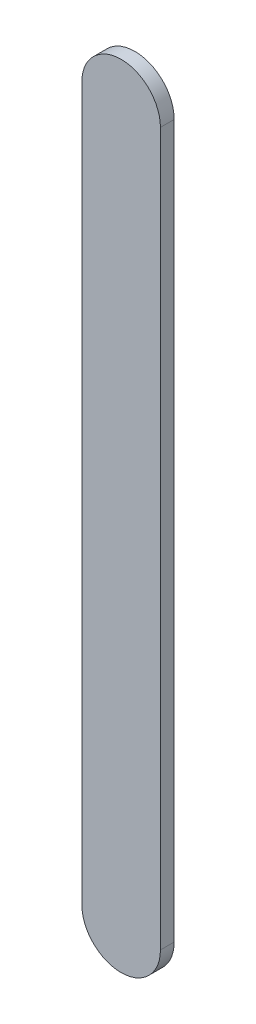
ISO-10303-21;
HEADER;
FILE_DESCRIPTION(('STEP AP214'),'2;1');
FILE_NAME('part.step','',(''),(''),'','','');
FILE_SCHEMA(('AUTOMOTIVE_DESIGN { 1 0 10303 214 1 1 1 1 }'));
ENDSEC;
DATA;
#1=APPLICATION_CONTEXT('core data for automotive mechanical design processes');
#2=APPLICATION_PROTOCOL_DEFINITION('international standard','automotive_design',2000,#1);
#3=PRODUCT_CONTEXT('',#1,'mechanical');
#4=PRODUCT('Part','Part','',(#3));
#5=PRODUCT_RELATED_PRODUCT_CATEGORY('part','',(#4));
#6=PRODUCT_DEFINITION_FORMATION('','',#4);
#7=PRODUCT_DEFINITION_CONTEXT('part definition',#1,'design');
#8=PRODUCT_DEFINITION('design','',#6,#7);
#9=PRODUCT_DEFINITION_SHAPE('','',#8);
#10=(LENGTH_UNIT() NAMED_UNIT(*) SI_UNIT(.MILLI.,.METRE.));
#11=(NAMED_UNIT(*) PLANE_ANGLE_UNIT() SI_UNIT($,.RADIAN.));
#12=(NAMED_UNIT(*) SI_UNIT($,.STERADIAN.) SOLID_ANGLE_UNIT());
#13=UNCERTAINTY_MEASURE_WITH_UNIT(LENGTH_MEASURE(1.E-05),#10,'distance_accuracy_value','');
#14=(GEOMETRIC_REPRESENTATION_CONTEXT(3) GLOBAL_UNCERTAINTY_ASSIGNED_CONTEXT((#13)) GLOBAL_UNIT_ASSIGNED_CONTEXT((#10,
#11,#12)) REPRESENTATION_CONTEXT('',''));
#15=CARTESIAN_POINT('',(0.,0.,0.));
#16=DIRECTION('',(0.,0.,1.));
#17=DIRECTION('',(1.,0.,0.));
#18=AXIS2_PLACEMENT_3D('',#15,#16,#17);
#19=CARTESIAN_POINT('',(84.35,-113.3375,1.635));
#20=DIRECTION('',(0.,0.,1.));
#21=DIRECTION('',(1.,0.,0.));
#22=AXIS2_PLACEMENT_3D('',#19,#20,#21);
#23=PLANE('',#22);
#24=DIRECTION('',(0.,-1.,0.));
#25=VECTOR('',#24,1.);
#26=CARTESIAN_POINT('',(84.35,-113.3375,1.635));
#27=LINE('',#26,#25);
#28=CARTESIAN_POINT('',(84.35,-113.3375,1.635));
#29=VERTEX_POINT('',#28);
#30=CARTESIAN_POINT('',(84.35,-115.15,1.635));
#31=VERTEX_POINT('',#30);
#32=EDGE_CURVE('E97',#29,#31,#27,.T.);
#33=ORIENTED_EDGE('',*,*,#32,.T.);
#34=CARTESIAN_POINT('',(84.45,-115.15,1.635));
#35=DIRECTION('',(0.,0.,1.));
#36=DIRECTION('',(-1.,0.,0.));
#37=AXIS2_PLACEMENT_3D('',#34,#35,#36);
#38=CIRCLE('',#37,0.1);
#39=CARTESIAN_POINT('',(84.55,-115.15,1.635));
#40=VERTEX_POINT('',#39);
#41=EDGE_CURVE('E76',#31,#40,#38,.T.);
#42=ORIENTED_EDGE('',*,*,#41,.T.);
#43=DIRECTION('',(0.,1.,0.));
#44=VECTOR('',#43,1.);
#45=CARTESIAN_POINT('',(84.55,-115.15,1.635));
#46=LINE('',#45,#44);
#47=CARTESIAN_POINT('',(84.55,-113.3375,1.635));
#48=VERTEX_POINT('',#47);
#49=EDGE_CURVE('E81',#40,#48,#46,.T.);
#50=ORIENTED_EDGE('',*,*,#49,.T.);
#51=CARTESIAN_POINT('',(84.45,-113.3375,1.635));
#52=DIRECTION('',(0.,0.,1.));
#53=DIRECTION('',(1.,-1.42108547152E-13,0.));
#54=AXIS2_PLACEMENT_3D('',#51,#52,#53);
#55=CIRCLE('',#54,0.1);
#56=EDGE_CURVE('E11',#48,#29,#55,.T.);
#57=ORIENTED_EDGE('',*,*,#56,.T.);
#58=EDGE_LOOP('',(#33,#42,#50,#57));
#59=FACE_BOUND('',#58,.T.);
#60=ADVANCED_FACE('F17',(#59),#23,.T.);
#61=CARTESIAN_POINT('',(84.35,-113.3375,1.6));
#62=DIRECTION('',(0.,0.,1.));
#63=DIRECTION('',(1.,0.,0.));
#64=AXIS2_PLACEMENT_3D('',#61,#62,#63);
#65=PLANE('',#64);
#66=CARTESIAN_POINT('',(84.45,-113.3375,1.6));
#67=DIRECTION('',(0.,0.,1.));
#68=DIRECTION('',(1.,-1.42108547152E-13,0.));
#69=AXIS2_PLACEMENT_3D('',#66,#67,#68);
#70=CIRCLE('',#69,0.1);
#71=CARTESIAN_POINT('',(84.55,-113.3375,1.6));
#72=VERTEX_POINT('',#71);
#73=CARTESIAN_POINT('',(84.35,-113.3375,1.6));
#74=VERTEX_POINT('',#73);
#75=EDGE_CURVE('E26',#72,#74,#70,.T.);
#76=ORIENTED_EDGE('',*,*,#75,.F.);
#77=DIRECTION('',(0.,1.,0.));
#78=VECTOR('',#77,1.);
#79=CARTESIAN_POINT('',(84.55,-115.15,1.6));
#80=LINE('',#79,#78);
#81=CARTESIAN_POINT('',(84.55,-115.15,1.6));
#82=VERTEX_POINT('',#81);
#83=EDGE_CURVE('E67',#82,#72,#80,.T.);
#84=ORIENTED_EDGE('',*,*,#83,.F.);
#85=CARTESIAN_POINT('',(84.45,-115.15,1.6));
#86=DIRECTION('',(0.,0.,1.));
#87=DIRECTION('',(-1.,0.,0.));
#88=AXIS2_PLACEMENT_3D('',#85,#86,#87);
#89=CIRCLE('',#88,0.1);
#90=CARTESIAN_POINT('',(84.35,-115.15,1.6));
#91=VERTEX_POINT('',#90);
#92=EDGE_CURVE('E70',#91,#82,#89,.T.);
#93=ORIENTED_EDGE('',*,*,#92,.F.);
#94=DIRECTION('',(0.,-1.,0.));
#95=VECTOR('',#94,1.);
#96=CARTESIAN_POINT('',(84.35,-113.3375,1.6));
#97=LINE('',#96,#95);
#98=EDGE_CURVE('E115',#74,#91,#97,.T.);
#99=ORIENTED_EDGE('',*,*,#98,.F.);
#100=EDGE_LOOP('',(#76,#84,#93,#99));
#101=FACE_BOUND('',#100,.T.);
#102=ADVANCED_FACE('F19',(#101),#65,.F.);
#103=CARTESIAN_POINT('',(84.45,-113.3375,1.6));
#104=DIRECTION('',(0.,0.,-1.));
#105=DIRECTION('',(1.,-1.42108547152E-13,0.));
#106=AXIS2_PLACEMENT_3D('',#103,#104,#105);
#107=CYLINDRICAL_SURFACE('',#106,0.1);
#108=ORIENTED_EDGE('',*,*,#75,.T.);
#109=DIRECTION('',(0.,0.,1.));
#110=VECTOR('',#109,1.);
#111=CARTESIAN_POINT('',(84.35,-113.3375,1.6));
#112=LINE('',#111,#110);
#113=EDGE_CURVE('E91',#74,#29,#112,.T.);
#114=ORIENTED_EDGE('',*,*,#113,.T.);
#115=ORIENTED_EDGE('',*,*,#56,.F.);
#116=DIRECTION('',(0.,0.,1.));
#117=VECTOR('',#116,1.);
#118=CARTESIAN_POINT('',(84.55,-113.3375,1.6));
#119=LINE('',#118,#117);
#120=EDGE_CURVE('E75',#72,#48,#119,.T.);
#121=ORIENTED_EDGE('',*,*,#120,.F.);
#122=EDGE_LOOP('',(#108,#114,#115,#121));
#123=FACE_BOUND('',#122,.T.);
#124=ADVANCED_FACE('F181',(#123),#107,.T.);
#125=CARTESIAN_POINT('',(84.55,-115.15,1.6));
#126=DIRECTION('',(-1.,0.,0.));
#127=DIRECTION('',(0.,0.,1.));
#128=AXIS2_PLACEMENT_3D('',#125,#126,#127);
#129=PLANE('',#128);
#130=ORIENTED_EDGE('',*,*,#83,.T.);
#131=ORIENTED_EDGE('',*,*,#120,.T.);
#132=ORIENTED_EDGE('',*,*,#49,.F.);
#133=DIRECTION('',(0.,0.,1.));
#134=VECTOR('',#133,1.);
#135=CARTESIAN_POINT('',(84.55,-115.15,1.6));
#136=LINE('',#135,#134);
#137=EDGE_CURVE('E79',#82,#40,#136,.T.);
#138=ORIENTED_EDGE('',*,*,#137,.F.);
#139=EDGE_LOOP('',(#130,#131,#132,#138));
#140=FACE_BOUND('',#139,.T.);
#141=ADVANCED_FACE('F80',(#140),#129,.F.);
#142=CARTESIAN_POINT('',(84.45,-115.15,1.6));
#143=DIRECTION('',(0.,0.,-1.));
#144=DIRECTION('',(-1.,0.,0.));
#145=AXIS2_PLACEMENT_3D('',#142,#143,#144);
#146=CYLINDRICAL_SURFACE('',#145,0.1);
#147=ORIENTED_EDGE('',*,*,#92,.T.);
#148=ORIENTED_EDGE('',*,*,#137,.T.);
#149=ORIENTED_EDGE('',*,*,#41,.F.);
#150=DIRECTION('',(0.,0.,1.));
#151=VECTOR('',#150,1.);
#152=CARTESIAN_POINT('',(84.35,-115.15,1.6));
#153=LINE('',#152,#151);
#154=EDGE_CURVE('E88',#91,#31,#153,.T.);
#155=ORIENTED_EDGE('',*,*,#154,.F.);
#156=EDGE_LOOP('',(#147,#148,#149,#155));
#157=FACE_BOUND('',#156,.T.);
#158=ADVANCED_FACE('F86',(#157),#146,.T.);
#159=CARTESIAN_POINT('',(84.35,-113.3375,1.6));
#160=DIRECTION('',(1.,0.,0.));
#161=DIRECTION('',(0.,1.,0.));
#162=AXIS2_PLACEMENT_3D('',#159,#160,#161);
#163=PLANE('',#162);
#164=ORIENTED_EDGE('',*,*,#98,.T.);
#165=ORIENTED_EDGE('',*,*,#154,.T.);
#166=ORIENTED_EDGE('',*,*,#32,.F.);
#167=ORIENTED_EDGE('',*,*,#113,.F.);
#168=EDGE_LOOP('',(#164,#165,#166,#167));
#169=FACE_BOUND('',#168,.T.);
#170=ADVANCED_FACE('F123',(#169),#163,.F.);
#171=CLOSED_SHELL('',(#60,#102,#124,#141,#158,#170));
#172=MANIFOLD_SOLID_BREP('B1',#171);
#173=ADVANCED_BREP_SHAPE_REPRESENTATION('',(#18,#172),#14);
#174=SHAPE_DEFINITION_REPRESENTATION(#9,#173);
ENDSEC;
END-ISO-10303-21;
